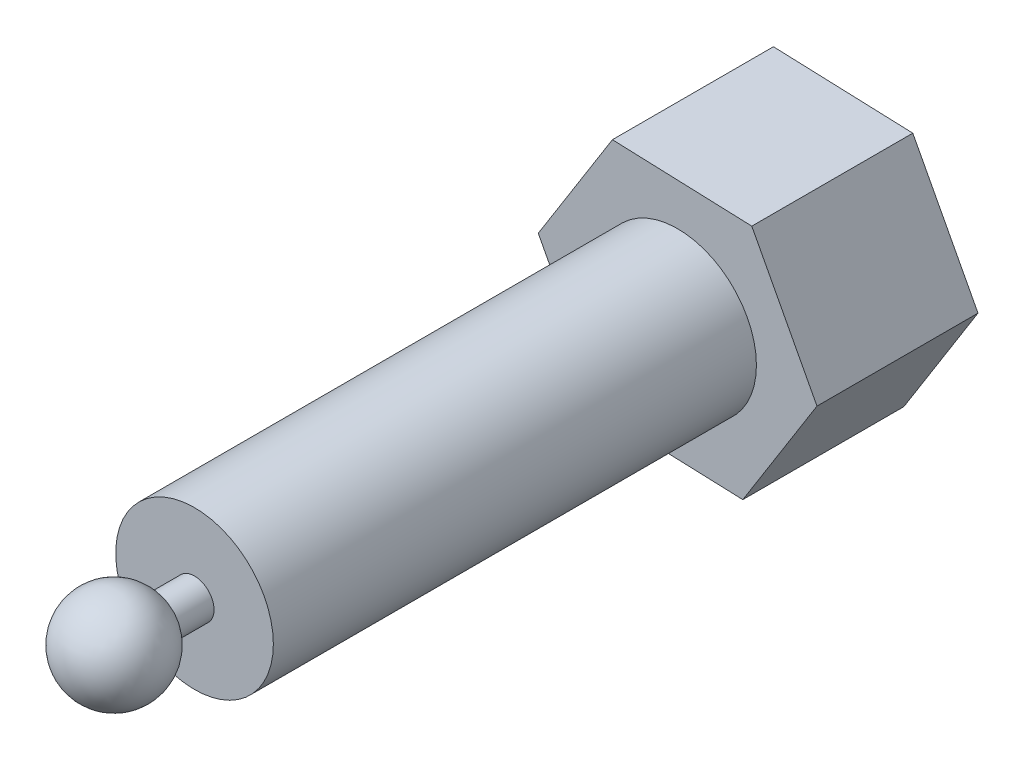
ISO-10303-21;
HEADER;
FILE_DESCRIPTION(('STEP AP214'),'2;1');
FILE_NAME('part.step','',(''),(''),'','','');
FILE_SCHEMA(('AUTOMOTIVE_DESIGN { 1 0 10303 214 1 1 1 1 }'));
ENDSEC;
DATA;
#1=APPLICATION_CONTEXT('core data for automotive mechanical design processes');
#2=APPLICATION_PROTOCOL_DEFINITION('international standard','automotive_design',2000,#1);
#3=PRODUCT_CONTEXT('',#1,'mechanical');
#4=PRODUCT('Part','Part','',(#3));
#5=PRODUCT_RELATED_PRODUCT_CATEGORY('part','',(#4));
#6=PRODUCT_DEFINITION_FORMATION('','',#4);
#7=PRODUCT_DEFINITION_CONTEXT('part definition',#1,'design');
#8=PRODUCT_DEFINITION('design','',#6,#7);
#9=PRODUCT_DEFINITION_SHAPE('','',#8);
#10=(LENGTH_UNIT() NAMED_UNIT(*) SI_UNIT(.MILLI.,.METRE.));
#11=(NAMED_UNIT(*) PLANE_ANGLE_UNIT() SI_UNIT($,.RADIAN.));
#12=(NAMED_UNIT(*) SI_UNIT($,.STERADIAN.) SOLID_ANGLE_UNIT());
#13=UNCERTAINTY_MEASURE_WITH_UNIT(LENGTH_MEASURE(1.E-05),#10,'distance_accuracy_value','');
#14=(GEOMETRIC_REPRESENTATION_CONTEXT(3) GLOBAL_UNCERTAINTY_ASSIGNED_CONTEXT((#13)) GLOBAL_UNIT_ASSIGNED_CONTEXT((#10,
#11,#12)) REPRESENTATION_CONTEXT('',''));
#15=CARTESIAN_POINT('',(0.,0.,0.));
#16=DIRECTION('',(0.,0.,1.));
#17=DIRECTION('',(1.,0.,0.));
#18=AXIS2_PLACEMENT_3D('',#15,#16,#17);
#19=CARTESIAN_POINT('',(0.,0.,45.));
#20=DIRECTION('',(0.,-1.,0.));
#21=DIRECTION('',(-1.,0.,0.));
#22=AXIS2_PLACEMENT_3D('',#19,#20,#21);
#23=SPHERICAL_SURFACE('',#22,3.);
#24=CARTESIAN_POINT('',(0.,-3.,45.));
#25=VERTEX_POINT('',#24);
#26=VERTEX_LOOP('',#25);
#27=FACE_BOUND('',#26,.T.);
#28=ADVANCED_FACE('F45',(#27),#23,.T.);
#29=CLOSED_SHELL('',(#28));
#30=MANIFOLD_SOLID_BREP('B2',#29);
#31=CARTESIAN_POINT('',(-4.605886333498,-7.3338810382291,10.));
#32=DIRECTION('',(0.0371668141871746,0.999309075273099,0.));
#33=DIRECTION('',(-0.999309075273099,0.0371668141871746,0.));
#34=AXIS2_PLACEMENT_3D('',#31,#32,#33);
#35=PLANE('',#34);
#36=DIRECTION('',(0.999309075273099,-0.0371668141871746,0.));
#37=VECTOR('',#36,1.);
#38=CARTESIAN_POINT('',(-4.605886333498,-7.3338810382291,0.));
#39=LINE('',#38,#37);
#40=CARTESIAN_POINT('',(-4.605886333498,-7.3338810382291,0.));
#41=VERTEX_POINT('',#40);
#42=CARTESIAN_POINT('',(4.04838412069038,-7.65575509086739,0.));
#43=VERTEX_POINT('',#42);
#44=EDGE_CURVE('E147',#41,#43,#39,.T.);
#45=ORIENTED_EDGE('',*,*,#44,.T.);
#46=DIRECTION('',(0.,0.,-1.));
#47=VECTOR('',#46,1.);
#48=CARTESIAN_POINT('',(4.04838412069038,-7.65575509086739,10.));
#49=LINE('',#48,#47);
#50=CARTESIAN_POINT('',(4.04838412069038,-7.65575509086739,10.));
#51=VERTEX_POINT('',#50);
#52=EDGE_CURVE('E63',#51,#43,#49,.T.);
#53=ORIENTED_EDGE('',*,*,#52,.F.);
#54=DIRECTION('',(0.999309075273099,-0.0371668141871746,0.));
#55=VECTOR('',#54,1.);
#56=CARTESIAN_POINT('',(-4.605886333498,-7.3338810382291,10.));
#57=LINE('',#56,#55);
#58=CARTESIAN_POINT('',(-4.605886333498,-7.3338810382291,10.));
#59=VERTEX_POINT('',#58);
#60=EDGE_CURVE('E158',#59,#51,#57,.T.);
#61=ORIENTED_EDGE('',*,*,#60,.F.);
#62=DIRECTION('',(0.,0.,-1.));
#63=VECTOR('',#62,1.);
#64=CARTESIAN_POINT('',(-4.605886333498,-7.3338810382291,10.));
#65=LINE('',#64,#63);
#66=EDGE_CURVE('E143',#59,#41,#65,.T.);
#67=ORIENTED_EDGE('',*,*,#66,.T.);
#68=EDGE_LOOP('',(#45,#53,#61,#67));
#69=FACE_BOUND('',#68,.T.);
#70=ADVANCED_FACE('F60',(#69),#35,.F.);
#71=CARTESIAN_POINT('',(4.04838412069038,-7.65575509086739,10.));
#72=DIRECTION('',(-0.846843638325252,0.531841942900378,0.));
#73=DIRECTION('',(-0.531841942900378,-0.846843638325252,0.));
#74=AXIS2_PLACEMENT_3D('',#71,#72,#73);
#75=PLANE('',#74);
#76=DIRECTION('',(0.531841942900378,0.846843638325252,0.));
#77=VECTOR('',#76,1.);
#78=CARTESIAN_POINT('',(4.04838412069038,-7.65575509086739,0.));
#79=LINE('',#78,#77);
#80=CARTESIAN_POINT('',(8.65427045418839,-0.32187405263829,0.));
#81=VERTEX_POINT('',#80);
#82=EDGE_CURVE('E150',#43,#81,#79,.T.);
#83=ORIENTED_EDGE('',*,*,#82,.T.);
#84=DIRECTION('',(0.,0.,-1.));
#85=VECTOR('',#84,1.);
#86=CARTESIAN_POINT('',(8.65427045418839,-0.32187405263829,10.));
#87=LINE('',#86,#85);
#88=CARTESIAN_POINT('',(8.65427045418839,-0.32187405263829,10.));
#89=VERTEX_POINT('',#88);
#90=EDGE_CURVE('E161',#89,#81,#87,.T.);
#91=ORIENTED_EDGE('',*,*,#90,.F.);
#92=DIRECTION('',(0.531841942900378,0.846843638325252,0.));
#93=VECTOR('',#92,1.);
#94=CARTESIAN_POINT('',(4.04838412069038,-7.65575509086739,10.));
#95=LINE('',#94,#93);
#96=EDGE_CURVE('E116',#51,#89,#95,.T.);
#97=ORIENTED_EDGE('',*,*,#96,.F.);
#98=ORIENTED_EDGE('',*,*,#52,.T.);
#99=EDGE_LOOP('',(#83,#91,#97,#98));
#100=FACE_BOUND('',#99,.T.);
#101=ADVANCED_FACE('F174',(#100),#75,.F.);
#102=CARTESIAN_POINT('',(8.65427045418839,-0.32187405263829,10.));
#103=DIRECTION('',(-0.884010452512427,-0.46746713237272,0.));
#104=DIRECTION('',(0.46746713237272,-0.884010452512427,0.));
#105=AXIS2_PLACEMENT_3D('',#102,#103,#104);
#106=PLANE('',#105);
#107=DIRECTION('',(-0.46746713237272,0.884010452512427,0.));
#108=VECTOR('',#107,1.);
#109=CARTESIAN_POINT('',(8.65427045418839,-0.32187405263829,0.));
#110=LINE('',#109,#108);
#111=CARTESIAN_POINT('',(4.60588633349801,7.33388103822909,0.));
#112=VERTEX_POINT('',#111);
#113=EDGE_CURVE('E153',#81,#112,#110,.T.);
#114=ORIENTED_EDGE('',*,*,#113,.T.);
#115=DIRECTION('',(0.,0.,-1.));
#116=VECTOR('',#115,1.);
#117=CARTESIAN_POINT('',(4.60588633349801,7.33388103822909,10.));
#118=LINE('',#117,#116);
#119=CARTESIAN_POINT('',(4.60588633349801,7.33388103822909,10.));
#120=VERTEX_POINT('',#119);
#121=EDGE_CURVE('E138',#120,#112,#118,.T.);
#122=ORIENTED_EDGE('',*,*,#121,.F.);
#123=DIRECTION('',(-0.46746713237272,0.884010452512427,0.));
#124=VECTOR('',#123,1.);
#125=CARTESIAN_POINT('',(8.65427045418839,-0.32187405263829,10.));
#126=LINE('',#125,#124);
#127=EDGE_CURVE('E129',#89,#120,#126,.T.);
#128=ORIENTED_EDGE('',*,*,#127,.F.);
#129=ORIENTED_EDGE('',*,*,#90,.T.);
#130=EDGE_LOOP('',(#114,#122,#128,#129));
#131=FACE_BOUND('',#130,.T.);
#132=ADVANCED_FACE('F175',(#131),#106,.F.);
#133=CARTESIAN_POINT('',(4.60588633349801,7.33388103822909,10.));
#134=DIRECTION('',(-0.0371668141871745,-0.999309075273099,0.));
#135=DIRECTION('',(0.999309075273099,-0.0371668141871745,0.));
#136=AXIS2_PLACEMENT_3D('',#133,#134,#135);
#137=PLANE('',#136);
#138=DIRECTION('',(-0.999309075273099,0.0371668141871745,0.));
#139=VECTOR('',#138,1.);
#140=CARTESIAN_POINT('',(4.60588633349801,7.33388103822909,0.));
#141=LINE('',#140,#139);
#142=CARTESIAN_POINT('',(-4.04838412069039,7.65575509086738,0.));
#143=VERTEX_POINT('',#142);
#144=EDGE_CURVE('E137',#112,#143,#141,.T.);
#145=ORIENTED_EDGE('',*,*,#144,.T.);
#146=DIRECTION('',(0.,0.,-1.));
#147=VECTOR('',#146,1.);
#148=CARTESIAN_POINT('',(-4.04838412069039,7.65575509086738,10.));
#149=LINE('',#148,#147);
#150=CARTESIAN_POINT('',(-4.04838412069039,7.65575509086738,10.));
#151=VERTEX_POINT('',#150);
#152=EDGE_CURVE('E134',#151,#143,#149,.T.);
#153=ORIENTED_EDGE('',*,*,#152,.F.);
#154=DIRECTION('',(-0.999309075273099,0.0371668141871745,0.));
#155=VECTOR('',#154,1.);
#156=CARTESIAN_POINT('',(4.60588633349801,7.33388103822909,10.));
#157=LINE('',#156,#155);
#158=EDGE_CURVE('E123',#120,#151,#157,.T.);
#159=ORIENTED_EDGE('',*,*,#158,.F.);
#160=ORIENTED_EDGE('',*,*,#121,.T.);
#161=EDGE_LOOP('',(#145,#153,#159,#160));
#162=FACE_BOUND('',#161,.T.);
#163=ADVANCED_FACE('F135',(#162),#137,.F.);
#164=CARTESIAN_POINT('',(-4.04838412069039,7.65575509086738,10.));
#165=DIRECTION('',(0.846843638325252,-0.531841942900378,0.));
#166=DIRECTION('',(0.531841942900378,0.846843638325252,0.));
#167=AXIS2_PLACEMENT_3D('',#164,#165,#166);
#168=PLANE('',#167);
#169=DIRECTION('',(-0.531841942900378,-0.846843638325252,0.));
#170=VECTOR('',#169,1.);
#171=CARTESIAN_POINT('',(-4.04838412069039,7.65575509086738,0.));
#172=LINE('',#171,#170);
#173=CARTESIAN_POINT('',(-8.65427045418839,0.321874052638291,0.));
#174=VERTEX_POINT('',#173);
#175=EDGE_CURVE('E101',#143,#174,#172,.T.);
#176=ORIENTED_EDGE('',*,*,#175,.T.);
#177=DIRECTION('',(0.,0.,-1.));
#178=VECTOR('',#177,1.);
#179=CARTESIAN_POINT('',(-8.65427045418839,0.321874052638291,10.));
#180=LINE('',#179,#178);
#181=CARTESIAN_POINT('',(-8.65427045418839,0.321874052638291,10.));
#182=VERTEX_POINT('',#181);
#183=EDGE_CURVE('E139',#182,#174,#180,.T.);
#184=ORIENTED_EDGE('',*,*,#183,.F.);
#185=DIRECTION('',(-0.531841942900378,-0.846843638325252,0.));
#186=VECTOR('',#185,1.);
#187=CARTESIAN_POINT('',(-4.04838412069039,7.65575509086738,10.));
#188=LINE('',#187,#186);
#189=EDGE_CURVE('E127',#151,#182,#188,.T.);
#190=ORIENTED_EDGE('',*,*,#189,.F.);
#191=ORIENTED_EDGE('',*,*,#152,.T.);
#192=EDGE_LOOP('',(#176,#184,#190,#191));
#193=FACE_BOUND('',#192,.T.);
#194=ADVANCED_FACE('F141',(#193),#168,.F.);
#195=CARTESIAN_POINT('',(-8.65427045418839,0.321874052638291,10.));
#196=DIRECTION('',(0.884010452512427,0.46746713237272,0.));
#197=DIRECTION('',(-0.46746713237272,0.884010452512427,0.));
#198=AXIS2_PLACEMENT_3D('',#195,#196,#197);
#199=PLANE('',#198);
#200=DIRECTION('',(0.46746713237272,-0.884010452512427,0.));
#201=VECTOR('',#200,1.);
#202=CARTESIAN_POINT('',(-8.65427045418839,0.321874052638291,0.));
#203=LINE('',#202,#201);
#204=EDGE_CURVE('E107',#174,#41,#203,.T.);
#205=ORIENTED_EDGE('',*,*,#204,.T.);
#206=ORIENTED_EDGE('',*,*,#66,.F.);
#207=DIRECTION('',(0.46746713237272,-0.884010452512427,0.));
#208=VECTOR('',#207,1.);
#209=CARTESIAN_POINT('',(-8.65427045418839,0.321874052638291,10.));
#210=LINE('',#209,#208);
#211=EDGE_CURVE('E78',#182,#59,#210,.T.);
#212=ORIENTED_EDGE('',*,*,#211,.F.);
#213=ORIENTED_EDGE('',*,*,#183,.T.);
#214=EDGE_LOOP('',(#205,#206,#212,#213));
#215=FACE_BOUND('',#214,.T.);
#216=ADVANCED_FACE('F180',(#215),#199,.F.);
#217=CARTESIAN_POINT('',(0.,0.,10.));
#218=DIRECTION('',(0.,0.,1.));
#219=DIRECTION('',(1.,0.,0.));
#220=AXIS2_PLACEMENT_3D('',#217,#218,#219);
#221=PLANE('',#220);
#222=CARTESIAN_POINT('',(0.,0.,10.));
#223=DIRECTION('',(0.,0.,1.));
#224=DIRECTION('',(1.,0.,0.));
#225=AXIS2_PLACEMENT_3D('',#222,#223,#224);
#226=CIRCLE('',#225,4.89405553349906);
#227=CARTESIAN_POINT('',(4.89405553349906,0.,10.));
#228=VERTEX_POINT('',#227);
#229=EDGE_CURVE('E69',#228,#228,#226,.T.);
#230=ORIENTED_EDGE('',*,*,#229,.F.);
#231=EDGE_LOOP('',(#230));
#232=FACE_BOUND('',#231,.T.);
#233=ORIENTED_EDGE('',*,*,#60,.T.);
#234=ORIENTED_EDGE('',*,*,#96,.T.);
#235=ORIENTED_EDGE('',*,*,#127,.T.);
#236=ORIENTED_EDGE('',*,*,#158,.T.);
#237=ORIENTED_EDGE('',*,*,#189,.T.);
#238=ORIENTED_EDGE('',*,*,#211,.T.);
#239=EDGE_LOOP('',(#233,#234,#235,#236,#237,#238));
#240=FACE_BOUND('',#239,.T.);
#241=ADVANCED_FACE('F125',(#232,#240),#221,.T.);
#242=CARTESIAN_POINT('',(0.,0.,0.));
#243=DIRECTION('',(0.,0.,1.));
#244=DIRECTION('',(1.,0.,0.));
#245=AXIS2_PLACEMENT_3D('',#242,#243,#244);
#246=PLANE('',#245);
#247=ORIENTED_EDGE('',*,*,#44,.F.);
#248=ORIENTED_EDGE('',*,*,#204,.F.);
#249=ORIENTED_EDGE('',*,*,#175,.F.);
#250=ORIENTED_EDGE('',*,*,#144,.F.);
#251=ORIENTED_EDGE('',*,*,#113,.F.);
#252=ORIENTED_EDGE('',*,*,#82,.F.);
#253=EDGE_LOOP('',(#247,#248,#249,#250,#251,#252));
#254=FACE_BOUND('',#253,.T.);
#255=ADVANCED_FACE('F178',(#254),#246,.F.);
#256=CARTESIAN_POINT('',(0.,0.,40.));
#257=DIRECTION('',(0.,0.,-1.));
#258=DIRECTION('',(-1.,0.,0.));
#259=AXIS2_PLACEMENT_3D('',#256,#257,#258);
#260=CYLINDRICAL_SURFACE('',#259,4.89405553349906);
#261=CARTESIAN_POINT('',(0.,0.,40.));
#262=DIRECTION('',(0.,0.,1.));
#263=DIRECTION('',(1.,0.,0.));
#264=AXIS2_PLACEMENT_3D('',#261,#262,#263);
#265=CIRCLE('',#264,4.89405553349906);
#266=CARTESIAN_POINT('',(4.89405553349906,0.,40.));
#267=VERTEX_POINT('',#266);
#268=EDGE_CURVE('E151',#267,#267,#265,.T.);
#269=ORIENTED_EDGE('',*,*,#268,.F.);
#270=EDGE_LOOP('',(#269));
#271=FACE_BOUND('',#270,.T.);
#272=ORIENTED_EDGE('',*,*,#229,.T.);
#273=EDGE_LOOP('',(#272));
#274=FACE_BOUND('',#273,.T.);
#275=ADVANCED_FACE('F225',(#271,#274),#260,.T.);
#276=CARTESIAN_POINT('',(0.,0.,40.));
#277=DIRECTION('',(0.,0.,1.));
#278=DIRECTION('',(1.,0.,0.));
#279=AXIS2_PLACEMENT_3D('',#276,#277,#278);
#280=PLANE('',#279);
#281=CARTESIAN_POINT('',(0.,0.,40.));
#282=DIRECTION('',(0.,0.,1.));
#283=DIRECTION('',(1.,0.,0.));
#284=AXIS2_PLACEMENT_3D('',#281,#282,#283);
#285=CIRCLE('',#284,1.21232607631816);
#286=CARTESIAN_POINT('',(1.21232607631816,0.,40.));
#287=VERTEX_POINT('',#286);
#288=EDGE_CURVE('E43',#287,#287,#285,.T.);
#289=ORIENTED_EDGE('',*,*,#288,.F.);
#290=EDGE_LOOP('',(#289));
#291=FACE_BOUND('',#290,.T.);
#292=ORIENTED_EDGE('',*,*,#268,.T.);
#293=EDGE_LOOP('',(#292));
#294=FACE_BOUND('',#293,.T.);
#295=ADVANCED_FACE('F240',(#291,#294),#280,.T.);
#296=CARTESIAN_POINT('',(0.,0.,45.));
#297=DIRECTION('',(0.,0.,-1.));
#298=DIRECTION('',(-1.,0.,0.));
#299=AXIS2_PLACEMENT_3D('',#296,#297,#298);
#300=CYLINDRICAL_SURFACE('',#299,1.21232607631816);
#301=CARTESIAN_POINT('',(0.,0.,45.));
#302=DIRECTION('',(0.,0.,1.));
#303=DIRECTION('',(1.,0.,0.));
#304=AXIS2_PLACEMENT_3D('',#301,#302,#303);
#305=CIRCLE('',#304,1.21232607631816);
#306=CARTESIAN_POINT('',(1.21232607631816,0.,45.));
#307=VERTEX_POINT('',#306);
#308=EDGE_CURVE('E310',#307,#307,#305,.T.);
#309=ORIENTED_EDGE('',*,*,#308,.F.);
#310=EDGE_LOOP('',(#309));
#311=FACE_BOUND('',#310,.T.);
#312=ORIENTED_EDGE('',*,*,#288,.T.);
#313=EDGE_LOOP('',(#312));
#314=FACE_BOUND('',#313,.T.);
#315=ADVANCED_FACE('F251',(#311,#314),#300,.T.);
#316=CARTESIAN_POINT('',(0.,0.,45.));
#317=DIRECTION('',(0.,0.,1.));
#318=DIRECTION('',(1.,0.,0.));
#319=AXIS2_PLACEMENT_3D('',#316,#317,#318);
#320=PLANE('',#319);
#321=ORIENTED_EDGE('',*,*,#308,.T.);
#322=EDGE_LOOP('',(#321));
#323=FACE_BOUND('',#322,.T.);
#324=ADVANCED_FACE('F259',(#323),#320,.T.);
#325=CLOSED_SHELL('',(#70,#101,#132,#163,#194,#216,#241,#255,#275,#295,#315,#324));
#326=MANIFOLD_SOLID_BREP('B6',#325);
#327=ADVANCED_BREP_SHAPE_REPRESENTATION('',(#18,#30,#326),#14);
#328=SHAPE_DEFINITION_REPRESENTATION(#9,#327);
ENDSEC;
END-ISO-10303-21;
